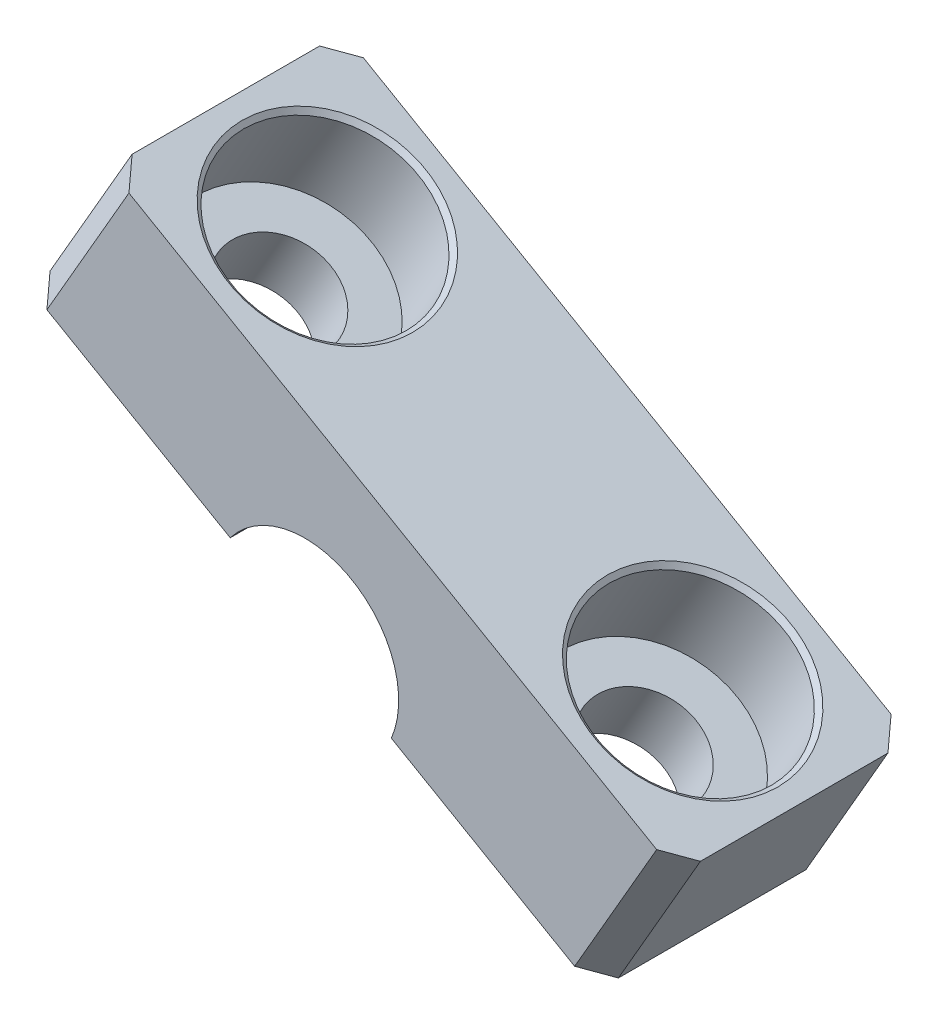
ISO-10303-21;
HEADER;
FILE_DESCRIPTION(('STEP AP214'),'2;1');
FILE_NAME('part.step','',(''),(''),'','','');
FILE_SCHEMA(('AUTOMOTIVE_DESIGN { 1 0 10303 214 1 1 1 1 }'));
ENDSEC;
DATA;
#1=APPLICATION_CONTEXT('core data for automotive mechanical design processes');
#2=APPLICATION_PROTOCOL_DEFINITION('international standard','automotive_design',2000,#1);
#3=PRODUCT_CONTEXT('',#1,'mechanical');
#4=PRODUCT('Part','Part','',(#3));
#5=PRODUCT_RELATED_PRODUCT_CATEGORY('part','',(#4));
#6=PRODUCT_DEFINITION_FORMATION('','',#4);
#7=PRODUCT_DEFINITION_CONTEXT('part definition',#1,'design');
#8=PRODUCT_DEFINITION('design','',#6,#7);
#9=PRODUCT_DEFINITION_SHAPE('','',#8);
#10=(LENGTH_UNIT() NAMED_UNIT(*) SI_UNIT(.MILLI.,.METRE.));
#11=(NAMED_UNIT(*) PLANE_ANGLE_UNIT() SI_UNIT($,.RADIAN.));
#12=(NAMED_UNIT(*) SI_UNIT($,.STERADIAN.) SOLID_ANGLE_UNIT());
#13=UNCERTAINTY_MEASURE_WITH_UNIT(LENGTH_MEASURE(1.E-05),#10,'distance_accuracy_value','');
#14=(GEOMETRIC_REPRESENTATION_CONTEXT(3) GLOBAL_UNCERTAINTY_ASSIGNED_CONTEXT((#13)) GLOBAL_UNIT_ASSIGNED_CONTEXT((#10,
#11,#12)) REPRESENTATION_CONTEXT('',''));
#15=CARTESIAN_POINT('',(0.,0.,0.));
#16=DIRECTION('',(0.,0.,1.));
#17=DIRECTION('',(1.,0.,0.));
#18=AXIS2_PLACEMENT_3D('',#15,#16,#17);
#19=CARTESIAN_POINT('',(18.1416697508025,57.4222937425251,34.));
#20=DIRECTION('',(0.5,0.866025403784439,0.));
#21=DIRECTION('',(-0.866025403784439,0.5,0.));
#22=AXIS2_PLACEMENT_3D('',#19,#20,#21);
#23=PLANE('',#22);
#24=CARTESIAN_POINT('',(21.6057713659404,55.4222937425251,34.));
#25=DIRECTION('',(-0.5,-0.866025403784439,0.));
#26=DIRECTION('',(0.866025403784439,-0.5,0.));
#27=AXIS2_PLACEMENT_3D('',#24,#25,#26);
#28=CIRCLE('',#27,2.25);
#29=CARTESIAN_POINT('',(23.5543285244554,54.2972937425251,34.));
#30=VERTEX_POINT('',#29);
#31=EDGE_CURVE('E20',#30,#30,#28,.T.);
#32=ORIENTED_EDGE('',*,*,#31,.T.);
#33=EDGE_LOOP('',(#32));
#34=FACE_BOUND('',#33,.T.);
#35=CARTESIAN_POINT('',(21.6057713659404,55.422293742525,34.));
#36=DIRECTION('',(-0.5,-0.866025403784439,0.));
#37=DIRECTION('',(0.866025403784439,-0.5,0.));
#38=AXIS2_PLACEMENT_3D('',#35,#36,#37);
#39=CIRCLE('',#38,4.);
#40=CARTESIAN_POINT('',(25.0698729810782,53.422293742525,34.));
#41=VERTEX_POINT('',#40);
#42=EDGE_CURVE('E139',#41,#41,#39,.F.);
#43=ORIENTED_EDGE('',*,*,#42,.T.);
#44=EDGE_LOOP('',(#43));
#45=FACE_BOUND('',#44,.T.);
#46=ADVANCED_FACE('F17',(#34,#45),#23,.T.);
#47=CARTESIAN_POINT('',(23.7057713659404,59.0596004384197,34.));
#48=DIRECTION('',(-0.5,-0.866025403784439,0.));
#49=DIRECTION('',(0.866025403784439,-0.5,0.));
#50=AXIS2_PLACEMENT_3D('',#47,#48,#49);
#51=CYLINDRICAL_SURFACE('',#50,2.25);
#52=CARTESIAN_POINT('',(20.2057713659404,52.9974226119286,34.));
#53=DIRECTION('',(-0.5,-0.866025403784439,0.));
#54=DIRECTION('',(0.866025403784439,-0.5,0.));
#55=AXIS2_PLACEMENT_3D('',#52,#53,#54);
#56=CIRCLE('',#55,2.25);
#57=CARTESIAN_POINT('',(22.1543285244554,51.8724226119286,34.));
#58=VERTEX_POINT('',#57);
#59=EDGE_CURVE('E135',#58,#58,#56,.F.);
#60=ORIENTED_EDGE('',*,*,#59,.F.);
#61=EDGE_LOOP('',(#60));
#62=FACE_BOUND('',#61,.T.);
#63=ORIENTED_EDGE('',*,*,#31,.F.);
#64=EDGE_LOOP('',(#63));
#65=FACE_BOUND('',#64,.T.);
#66=ADVANCED_FACE('F151',(#62,#65),#51,.F.);
#67=CARTESIAN_POINT('',(39.2942286340602,50.0596004384197,34.));
#68=DIRECTION('',(-0.5,-0.866025403784439,0.));
#69=DIRECTION('',(0.866025403784439,-0.5,0.));
#70=AXIS2_PLACEMENT_3D('',#67,#68,#69);
#71=CYLINDRICAL_SURFACE('',#70,2.25);
#72=CARTESIAN_POINT('',(35.7942286340602,43.9974226119287,34.));
#73=DIRECTION('',(-0.5,-0.866025403784439,0.));
#74=DIRECTION('',(0.866025403784439,-0.5,0.));
#75=AXIS2_PLACEMENT_3D('',#72,#73,#74);
#76=CIRCLE('',#75,2.25);
#77=CARTESIAN_POINT('',(37.7427857925752,42.8724226119287,34.));
#78=VERTEX_POINT('',#77);
#79=EDGE_CURVE('E131',#78,#78,#76,.F.);
#80=ORIENTED_EDGE('',*,*,#79,.F.);
#81=EDGE_LOOP('',(#80));
#82=FACE_BOUND('',#81,.T.);
#83=CARTESIAN_POINT('',(37.1942286340602,46.4222937425251,34.));
#84=DIRECTION('',(-0.5,-0.866025403784439,0.));
#85=DIRECTION('',(0.866025403784439,-0.5,0.));
#86=AXIS2_PLACEMENT_3D('',#83,#84,#85);
#87=CIRCLE('',#86,2.25);
#88=CARTESIAN_POINT('',(39.1427857925752,45.2972937425251,34.));
#89=VERTEX_POINT('',#88);
#90=EDGE_CURVE('E142',#89,#89,#87,.T.);
#91=ORIENTED_EDGE('',*,*,#90,.F.);
#92=EDGE_LOOP('',(#91));
#93=FACE_BOUND('',#92,.T.);
#94=ADVANCED_FACE('F153',(#82,#93),#71,.F.);
#95=CARTESIAN_POINT('',(33.7301270189224,48.4222937425251,34.));
#96=DIRECTION('',(0.5,0.866025403784439,0.));
#97=DIRECTION('',(-0.866025403784439,0.5,0.));
#98=AXIS2_PLACEMENT_3D('',#95,#96,#97);
#99=PLANE('',#98);
#100=ORIENTED_EDGE('',*,*,#90,.T.);
#101=EDGE_LOOP('',(#100));
#102=FACE_BOUND('',#101,.T.);
#103=CARTESIAN_POINT('',(37.1942286340602,46.4222937425251,34.));
#104=DIRECTION('',(-0.5,-0.866025403784439,0.));
#105=DIRECTION('',(0.866025403784439,-0.5,0.));
#106=AXIS2_PLACEMENT_3D('',#103,#104,#105);
#107=CIRCLE('',#106,4.);
#108=CARTESIAN_POINT('',(40.658330249198,44.4222937425251,34.));
#109=VERTEX_POINT('',#108);
#110=EDGE_CURVE('E127',#109,#109,#107,.F.);
#111=ORIENTED_EDGE('',*,*,#110,.T.);
#112=EDGE_LOOP('',(#111));
#113=FACE_BOUND('',#112,.T.);
#114=ADVANCED_FACE('F161',(#102,#113),#99,.T.);
#115=CARTESIAN_POINT('',(23.7057713659404,59.0596004384197,34.));
#116=DIRECTION('',(-0.5,-0.866025403784439,0.));
#117=DIRECTION('',(0.866025403784439,-0.5,0.));
#118=AXIS2_PLACEMENT_3D('',#115,#116,#117);
#119=CYLINDRICAL_SURFACE('',#118,4.);
#120=CARTESIAN_POINT('',(23.6057713659232,58.8863953576335,34.));
#121=DIRECTION('',(0.5,0.866025403784439,0.));
#122=DIRECTION('',(0.866025403784439,-0.5,0.));
#123=AXIS2_PLACEMENT_3D('',#120,#121,#122);
#124=CIRCLE('',#123,3.99999999996488);
#125=CARTESIAN_POINT('',(27.0698729810306,56.8863953576511,34.));
#126=VERTEX_POINT('',#125);
#127=EDGE_CURVE('E130',#126,#126,#124,.T.);
#128=ORIENTED_EDGE('',*,*,#127,.T.);
#129=EDGE_LOOP('',(#128));
#130=FACE_BOUND('',#129,.T.);
#131=ORIENTED_EDGE('',*,*,#42,.F.);
#132=EDGE_LOOP('',(#131));
#133=FACE_BOUND('',#132,.T.);
#134=ADVANCED_FACE('F223',(#130,#133),#119,.F.);
#135=CARTESIAN_POINT('',(17.1836570489103,56.7629670685515,29.5));
#136=DIRECTION('',(-0.612372435695794,0.353553390593274,-0.707106781186548));
#137=DIRECTION('',(-0.755928946018455,0.,0.654653670707977));
#138=AXIS2_PLACEMENT_3D('',#135,#136,#137);
#139=PLANE('',#138);
#140=DIRECTION('',(0.612372435695756,-0.353553390593253,-0.707106781186591));
#141=VECTOR('',#140,1.);
#142=CARTESIAN_POINT('',(15.8756443470182,55.4974226119286,30.));
#143=LINE('',#142,#141);
#144=CARTESIAN_POINT('',(15.8756443470182,55.4974226119286,30.));
#145=VERTEX_POINT('',#144);
#146=CARTESIAN_POINT('',(16.7416697508025,54.9974226119287,29.));
#147=VERTEX_POINT('',#146);
#148=EDGE_CURVE('E110',#145,#147,#143,.T.);
#149=ORIENTED_EDGE('',*,*,#148,.F.);
#150=DIRECTION('',(-0.5,-0.866025403784439,0.));
#151=VECTOR('',#150,1.);
#152=CARTESIAN_POINT('',(15.8756443470182,55.4974226119287,30.));
#153=LINE('',#152,#151);
#154=CARTESIAN_POINT('',(19.3756443470181,61.5596004384197,30.));
#155=VERTEX_POINT('',#154);
#156=EDGE_CURVE('E122',#155,#145,#153,.T.);
#157=ORIENTED_EDGE('',*,*,#156,.F.);
#158=DIRECTION('',(0.612372435695788,-0.353553390593285,-0.707106781186548));
#159=VECTOR('',#158,1.);
#160=CARTESIAN_POINT('',(19.375644347018,61.5596004384197,30.));
#161=LINE('',#160,#159);
#162=CARTESIAN_POINT('',(20.2416697508025,61.0596004384197,29.));
#163=VERTEX_POINT('',#162);
#164=EDGE_CURVE('E141',#155,#163,#161,.T.);
#165=ORIENTED_EDGE('',*,*,#164,.T.);
#166=DIRECTION('',(-0.5,-0.866025403784436,0.));
#167=VECTOR('',#166,1.);
#168=CARTESIAN_POINT('',(20.2416697508025,61.0596004384197,29.));
#169=LINE('',#168,#167);
#170=EDGE_CURVE('E113',#163,#147,#169,.T.);
#171=ORIENTED_EDGE('',*,*,#170,.T.);
#172=EDGE_LOOP('',(#149,#157,#165,#171));
#173=FACE_BOUND('',#172,.T.);
#174=ADVANCED_FACE('F220',(#173),#139,.T.);
#175=CARTESIAN_POINT('',(27.75,48.0644099100364,39.));
#176=DIRECTION('',(0.,0.,1.));
#177=DIRECTION('',(1.,0.,0.));
#178=AXIS2_PLACEMENT_3D('',#175,#176,#177);
#179=CYLINDRICAL_SURFACE('',#178,4.);
#180=CARTESIAN_POINT('',(27.75,48.0644099100364,39.));
#181=DIRECTION('',(0.,0.,1.));
#182=DIRECTION('',(1.,0.,0.));
#183=AXIS2_PLACEMENT_3D('',#180,#181,#182);
#184=CIRCLE('',#183,4.);
#185=CARTESIAN_POINT('',(24.5630682287833,50.4817360952272,39.));
#186=VERTEX_POINT('',#185);
#187=CARTESIAN_POINT('',(31.436931771217,46.5131091286303,39.));
#188=VERTEX_POINT('',#187);
#189=EDGE_CURVE('E98',#186,#188,#184,.F.);
#190=ORIENTED_EDGE('',*,*,#189,.F.);
#191=DIRECTION('',(0.,0.,1.));
#192=VECTOR('',#191,1.);
#193=CARTESIAN_POINT('',(24.5630682287834,50.4817360952271,29.));
#194=LINE('',#193,#192);
#195=CARTESIAN_POINT('',(24.5630682287833,50.4817360952272,29.));
#196=VERTEX_POINT('',#195);
#197=EDGE_CURVE('E91',#196,#186,#194,.T.);
#198=ORIENTED_EDGE('',*,*,#197,.F.);
#199=CARTESIAN_POINT('',(27.75,48.0644099100364,29.));
#200=DIRECTION('',(0.,0.,1.));
#201=DIRECTION('',(1.,0.,0.));
#202=AXIS2_PLACEMENT_3D('',#199,#200,#201);
#203=CIRCLE('',#202,4.);
#204=CARTESIAN_POINT('',(31.436931771217,46.5131091286303,29.));
#205=VERTEX_POINT('',#204);
#206=EDGE_CURVE('E95',#196,#205,#203,.F.);
#207=ORIENTED_EDGE('',*,*,#206,.T.);
#208=DIRECTION('',(0.,0.,1.));
#209=VECTOR('',#208,1.);
#210=CARTESIAN_POINT('',(31.4369317712171,46.5131091286302,29.));
#211=LINE('',#210,#209);
#212=EDGE_CURVE('E367',#188,#205,#211,.F.);
#213=ORIENTED_EDGE('',*,*,#212,.F.);
#214=EDGE_LOOP('',(#190,#198,#207,#213));
#215=FACE_BOUND('',#214,.T.);
#216=ADVANCED_FACE('F93',(#215),#179,.F.);
#217=CARTESIAN_POINT('',(18.0586570489103,58.2785115251742,38.5));
#218=DIRECTION('',(-0.612372435695794,0.353553390593274,0.707106781186548));
#219=DIRECTION('',(0.755928946018455,0.,0.654653670707977));
#220=AXIS2_PLACEMENT_3D('',#217,#218,#219);
#221=PLANE('',#220);
#222=DIRECTION('',(-0.612372435695755,0.353553390593252,-0.707106781186593));
#223=VECTOR('',#222,1.);
#224=CARTESIAN_POINT('',(16.7416697508025,54.9974226119287,39.));
#225=LINE('',#224,#223);
#226=CARTESIAN_POINT('',(16.7416697508025,54.9974226119287,39.));
#227=VERTEX_POINT('',#226);
#228=CARTESIAN_POINT('',(15.8756443470182,55.4974226119287,38.));
#229=VERTEX_POINT('',#228);
#230=EDGE_CURVE('E102',#227,#229,#225,.T.);
#231=ORIENTED_EDGE('',*,*,#230,.F.);
#232=DIRECTION('',(-0.5,-0.866025403784436,0.));
#233=VECTOR('',#232,1.);
#234=CARTESIAN_POINT('',(20.2416697508025,61.0596004384197,39.));
#235=LINE('',#234,#233);
#236=CARTESIAN_POINT('',(20.2416697508025,61.0596004384197,39.));
#237=VERTEX_POINT('',#236);
#238=EDGE_CURVE('E373',#237,#227,#235,.T.);
#239=ORIENTED_EDGE('',*,*,#238,.F.);
#240=DIRECTION('',(-0.612372435695788,0.353553390593284,-0.707106781186548));
#241=VECTOR('',#240,1.);
#242=CARTESIAN_POINT('',(20.2416697508025,61.0596004384197,39.));
#243=LINE('',#242,#241);
#244=CARTESIAN_POINT('',(19.3756443470181,61.5596004384197,38.));
#245=VERTEX_POINT('',#244);
#246=EDGE_CURVE('E103',#237,#245,#243,.T.);
#247=ORIENTED_EDGE('',*,*,#246,.T.);
#248=DIRECTION('',(-0.5,-0.866025403784439,0.));
#249=VECTOR('',#248,1.);
#250=CARTESIAN_POINT('',(15.8756443470182,55.4974226119287,38.));
#251=LINE('',#250,#249);
#252=EDGE_CURVE('E119',#229,#245,#251,.F.);
#253=ORIENTED_EDGE('',*,*,#252,.F.);
#254=EDGE_LOOP('',(#231,#239,#247,#253));
#255=FACE_BOUND('',#254,.T.);
#256=ADVANCED_FACE('F213',(#255),#221,.T.);
#257=CARTESIAN_POINT('',(40.1243556529823,41.4974226119287,29.));
#258=DIRECTION('',(-0.5,-0.866025403784439,0.));
#259=DIRECTION('',(0.866025403784439,-0.5,0.));
#260=AXIS2_PLACEMENT_3D('',#257,#258,#259);
#261=PLANE('',#260);
#262=ORIENTED_EDGE('',*,*,#59,.T.);
#263=EDGE_LOOP('',(#262));
#264=FACE_BOUND('',#263,.T.);
#265=ORIENTED_EDGE('',*,*,#148,.T.);
#266=DIRECTION('',(0.866025403784444,-0.499999999999992,0.));
#267=VECTOR('',#266,1.);
#268=CARTESIAN_POINT('',(16.7416697508025,54.9974226119287,29.));
#269=LINE('',#268,#267);
#270=EDGE_CURVE('E107',#147,#196,#269,.T.);
#271=ORIENTED_EDGE('',*,*,#270,.T.);
#272=ORIENTED_EDGE('',*,*,#197,.T.);
#273=DIRECTION('',(0.866025403784444,-0.499999999999992,0.));
#274=VECTOR('',#273,1.);
#275=CARTESIAN_POINT('',(16.7416697508025,54.9974226119287,39.));
#276=LINE('',#275,#274);
#277=EDGE_CURVE('E376',#227,#186,#276,.T.);
#278=ORIENTED_EDGE('',*,*,#277,.F.);
#279=ORIENTED_EDGE('',*,*,#230,.T.);
#280=DIRECTION('',(0.,0.,1.));
#281=VECTOR('',#280,1.);
#282=CARTESIAN_POINT('',(15.8756443470182,55.4974226119287,29.));
#283=LINE('',#282,#281);
#284=EDGE_CURVE('E438',#145,#229,#283,.T.);
#285=ORIENTED_EDGE('',*,*,#284,.F.);
#286=EDGE_LOOP('',(#265,#271,#272,#278,#279,#285));
#287=FACE_BOUND('',#286,.T.);
#288=ADVANCED_FACE('F108',(#264,#287),#261,.T.);
#289=CARTESIAN_POINT('',(42.3163429510902,46.2940559817969,29.5));
#290=DIRECTION('',(0.612372435695794,-0.353553390593274,-0.707106781186548));
#291=DIRECTION('',(-0.755928946018455,0.,-0.654653670707977));
#292=AXIS2_PLACEMENT_3D('',#289,#290,#291);
#293=PLANE('',#292);
#294=DIRECTION('',(0.612372435695789,-0.353553390593285,0.707106781186547));
#295=VECTOR('',#294,1.);
#296=CARTESIAN_POINT('',(42.758330249198,48.0596004384197,29.));
#297=LINE('',#296,#295);
#298=CARTESIAN_POINT('',(42.758330249198,48.0596004384197,29.));
#299=VERTEX_POINT('',#298);
#300=CARTESIAN_POINT('',(43.6243556529823,47.5596004384197,30.));
#301=VERTEX_POINT('',#300);
#302=EDGE_CURVE('E138',#299,#301,#297,.T.);
#303=ORIENTED_EDGE('',*,*,#302,.T.);
#304=DIRECTION('',(0.5,0.866025403784439,0.));
#305=VECTOR('',#304,1.);
#306=CARTESIAN_POINT('',(43.6243556529823,47.5596004384197,30.));
#307=LINE('',#306,#305);
#308=CARTESIAN_POINT('',(40.1243556529823,41.4974226119287,30.));
#309=VERTEX_POINT('',#308);
#310=EDGE_CURVE('E431',#309,#301,#307,.T.);
#311=ORIENTED_EDGE('',*,*,#310,.F.);
#312=DIRECTION('',(0.612372435695784,-0.353553390593271,0.707106781186558));
#313=VECTOR('',#312,1.);
#314=CARTESIAN_POINT('',(39.2583302491979,41.9974226119287,29.));
#315=LINE('',#314,#313);
#316=CARTESIAN_POINT('',(39.2583302491979,41.9974226119287,29.));
#317=VERTEX_POINT('',#316);
#318=EDGE_CURVE('E390',#317,#309,#315,.T.);
#319=ORIENTED_EDGE('',*,*,#318,.F.);
#320=DIRECTION('',(0.5,0.866025403784436,0.));
#321=VECTOR('',#320,1.);
#322=CARTESIAN_POINT('',(39.2583302491979,41.9974226119287,29.));
#323=LINE('',#322,#321);
#324=EDGE_CURVE('E359',#317,#299,#323,.T.);
#325=ORIENTED_EDGE('',*,*,#324,.T.);
#326=EDGE_LOOP('',(#303,#311,#319,#325));
#327=FACE_BOUND('',#326,.T.);
#328=ADVANCED_FACE('F206',(#327),#293,.T.);
#329=CARTESIAN_POINT('',(43.1913429510902,47.8096004384197,38.5));
#330=DIRECTION('',(0.612372435695794,-0.353553390593274,0.707106781186548));
#331=DIRECTION('',(0.755928946018455,0.,-0.654653670707977));
#332=AXIS2_PLACEMENT_3D('',#329,#330,#331);
#333=PLANE('',#332);
#334=DIRECTION('',(-0.612372435695788,0.35355339059329,0.707106781186545));
#335=VECTOR('',#334,1.);
#336=CARTESIAN_POINT('',(43.6243556529823,47.5596004384197,38.));
#337=LINE('',#336,#335);
#338=CARTESIAN_POINT('',(43.6243556529823,47.5596004384197,38.));
#339=VERTEX_POINT('',#338);
#340=CARTESIAN_POINT('',(42.758330249198,48.0596004384197,39.));
#341=VERTEX_POINT('',#340);
#342=EDGE_CURVE('E35',#339,#341,#337,.T.);
#343=ORIENTED_EDGE('',*,*,#342,.T.);
#344=DIRECTION('',(0.5,0.866025403784436,0.));
#345=VECTOR('',#344,1.);
#346=CARTESIAN_POINT('',(39.2583302491979,41.9974226119287,39.));
#347=LINE('',#346,#345);
#348=CARTESIAN_POINT('',(39.2583302491979,41.9974226119287,39.));
#349=VERTEX_POINT('',#348);
#350=EDGE_CURVE('E377',#349,#341,#347,.T.);
#351=ORIENTED_EDGE('',*,*,#350,.F.);
#352=DIRECTION('',(-0.612372435695783,0.35355339059327,0.70710678118656));
#353=VECTOR('',#352,1.);
#354=CARTESIAN_POINT('',(40.1243556529823,41.4974226119287,38.));
#355=LINE('',#354,#353);
#356=CARTESIAN_POINT('',(40.1243556529823,41.4974226119287,38.));
#357=VERTEX_POINT('',#356);
#358=EDGE_CURVE('E134',#357,#349,#355,.T.);
#359=ORIENTED_EDGE('',*,*,#358,.F.);
#360=DIRECTION('',(0.5,0.866025403784439,0.));
#361=VECTOR('',#360,1.);
#362=CARTESIAN_POINT('',(43.6243556529823,47.5596004384197,38.));
#363=LINE('',#362,#361);
#364=EDGE_CURVE('E426',#339,#357,#363,.F.);
#365=ORIENTED_EDGE('',*,*,#364,.F.);
#366=EDGE_LOOP('',(#343,#351,#359,#365));
#367=FACE_BOUND('',#366,.T.);
#368=ADVANCED_FACE('F202',(#367),#333,.T.);
#369=CARTESIAN_POINT('',(40.1243556529823,41.4974226119287,29.));
#370=DIRECTION('',(-0.5,-0.866025403784439,0.));
#371=DIRECTION('',(0.866025403784439,-0.5,0.));
#372=AXIS2_PLACEMENT_3D('',#369,#370,#371);
#373=PLANE('',#372);
#374=ORIENTED_EDGE('',*,*,#79,.T.);
#375=EDGE_LOOP('',(#374));
#376=FACE_BOUND('',#375,.T.);
#377=ORIENTED_EDGE('',*,*,#358,.T.);
#378=DIRECTION('',(0.866025403784441,-0.5,0.));
#379=VECTOR('',#378,1.);
#380=CARTESIAN_POINT('',(31.4369317712171,46.5131091286302,39.));
#381=LINE('',#380,#379);
#382=EDGE_CURVE('E396',#188,#349,#381,.T.);
#383=ORIENTED_EDGE('',*,*,#382,.F.);
#384=ORIENTED_EDGE('',*,*,#212,.T.);
#385=DIRECTION('',(0.866025403784441,-0.5,0.));
#386=VECTOR('',#385,1.);
#387=CARTESIAN_POINT('',(31.4369317712171,46.5131091286302,29.));
#388=LINE('',#387,#386);
#389=EDGE_CURVE('E118',#205,#317,#388,.T.);
#390=ORIENTED_EDGE('',*,*,#389,.T.);
#391=ORIENTED_EDGE('',*,*,#318,.T.);
#392=DIRECTION('',(0.,0.,1.));
#393=VECTOR('',#392,1.);
#394=CARTESIAN_POINT('',(40.1243556529824,41.4974226119287,29.));
#395=LINE('',#394,#393);
#396=EDGE_CURVE('E422',#357,#309,#395,.F.);
#397=ORIENTED_EDGE('',*,*,#396,.F.);
#398=EDGE_LOOP('',(#377,#383,#384,#390,#391,#397));
#399=FACE_BOUND('',#398,.T.);
#400=ADVANCED_FACE('F198',(#376,#399),#373,.T.);
#401=CARTESIAN_POINT('',(39.2942286340602,50.0596004384197,34.));
#402=DIRECTION('',(-0.5,-0.866025403784439,0.));
#403=DIRECTION('',(0.866025403784439,-0.5,0.));
#404=AXIS2_PLACEMENT_3D('',#401,#402,#403);
#405=CYLINDRICAL_SURFACE('',#404,4.);
#406=CARTESIAN_POINT('',(39.1942286340484,49.8863953576424,34.));
#407=DIRECTION('',(0.5,0.866025403784439,0.));
#408=DIRECTION('',(0.866025403784439,-0.5,0.));
#409=AXIS2_PLACEMENT_3D('',#406,#407,#408);
#410=CIRCLE('',#409,4.00000000001174);
#411=CARTESIAN_POINT('',(35.7301270189028,51.8863953576469,34.));
#412=VERTEX_POINT('',#411);
#413=EDGE_CURVE('E425',#412,#412,#410,.T.);
#414=ORIENTED_EDGE('',*,*,#413,.T.);
#415=EDGE_LOOP('',(#414));
#416=FACE_BOUND('',#415,.T.);
#417=ORIENTED_EDGE('',*,*,#110,.F.);
#418=EDGE_LOOP('',(#417));
#419=FACE_BOUND('',#418,.T.);
#420=ADVANCED_FACE('F194',(#416,#419),#405,.F.);
#421=CARTESIAN_POINT('',(23.7057713659486,59.0596004384344,34.));
#422=DIRECTION('',(0.5,0.86602540378444,0.));
#423=DIRECTION('',(-0.86602540378444,0.5,0.));
#424=AXIS2_PLACEMENT_3D('',#421,#422,#423);
#425=CONICAL_SURFACE('',#424,4.20000000000415,0.785398163375633);
#426=CARTESIAN_POINT('',(23.7057713659486,59.0596004384344,34.));
#427=DIRECTION('',(0.5,0.86602540378444,0.));
#428=DIRECTION('',(-0.86602540378444,0.5,0.));
#429=AXIS2_PLACEMENT_3D('',#426,#427,#428);
#430=CIRCLE('',#429,4.20000000000417);
#431=CARTESIAN_POINT('',(20.0684646700504,61.1596004384365,34.));
#432=VERTEX_POINT('',#431);
#433=EDGE_CURVE('E411',#432,#432,#430,.F.);
#434=ORIENTED_EDGE('',*,*,#433,.F.);
#435=EDGE_LOOP('',(#434));
#436=FACE_BOUND('',#435,.T.);
#437=ORIENTED_EDGE('',*,*,#127,.F.);
#438=EDGE_LOOP('',(#437));
#439=FACE_BOUND('',#438,.T.);
#440=ADVANCED_FACE('F191',(#436,#439),#425,.F.);
#441=CARTESIAN_POINT('',(29.75,51.5285115251742,29.));
#442=DIRECTION('',(0.,0.,1.));
#443=DIRECTION('',(1.,0.,0.));
#444=AXIS2_PLACEMENT_3D('',#441,#442,#443);
#445=PLANE('',#444);
#446=ORIENTED_EDGE('',*,*,#270,.F.);
#447=ORIENTED_EDGE('',*,*,#170,.F.);
#448=DIRECTION('',(-0.866025403784439,0.5,0.));
#449=VECTOR('',#448,1.);
#450=CARTESIAN_POINT('',(19.3756443470181,61.5596004384197,29.));
#451=LINE('',#450,#449);
#452=EDGE_CURVE('E408',#299,#163,#451,.T.);
#453=ORIENTED_EDGE('',*,*,#452,.F.);
#454=ORIENTED_EDGE('',*,*,#324,.F.);
#455=ORIENTED_EDGE('',*,*,#389,.F.);
#456=ORIENTED_EDGE('',*,*,#206,.F.);
#457=EDGE_LOOP('',(#446,#447,#453,#454,#455,#456));
#458=FACE_BOUND('',#457,.T.);
#459=ADVANCED_FACE('F115',(#458),#445,.F.);
#460=CARTESIAN_POINT('',(15.8756443470182,55.4974226119287,29.));
#461=DIRECTION('',(-0.866025403784439,0.5,0.));
#462=DIRECTION('',(-0.5,-0.866025403784439,0.));
#463=AXIS2_PLACEMENT_3D('',#460,#461,#462);
#464=PLANE('',#463);
#465=ORIENTED_EDGE('',*,*,#156,.T.);
#466=ORIENTED_EDGE('',*,*,#284,.T.);
#467=ORIENTED_EDGE('',*,*,#252,.T.);
#468=DIRECTION('',(0.,0.,1.));
#469=VECTOR('',#468,1.);
#470=CARTESIAN_POINT('',(19.3756443470181,61.5596004384197,29.));
#471=LINE('',#470,#469);
#472=EDGE_CURVE('E385',#155,#245,#471,.T.);
#473=ORIENTED_EDGE('',*,*,#472,.F.);
#474=EDGE_LOOP('',(#465,#466,#467,#473));
#475=FACE_BOUND('',#474,.T.);
#476=ADVANCED_FACE('F184',(#475),#464,.T.);
#477=CARTESIAN_POINT('',(43.6243556529823,47.5596004384197,39.));
#478=DIRECTION('',(0.,0.,1.));
#479=DIRECTION('',(1.,0.,0.));
#480=AXIS2_PLACEMENT_3D('',#477,#478,#479);
#481=PLANE('',#480);
#482=ORIENTED_EDGE('',*,*,#238,.T.);
#483=ORIENTED_EDGE('',*,*,#277,.T.);
#484=ORIENTED_EDGE('',*,*,#189,.T.);
#485=ORIENTED_EDGE('',*,*,#382,.T.);
#486=ORIENTED_EDGE('',*,*,#350,.T.);
#487=DIRECTION('',(-0.866025403784439,0.5,0.));
#488=VECTOR('',#487,1.);
#489=CARTESIAN_POINT('',(19.3756443470181,61.5596004384197,39.));
#490=LINE('',#489,#488);
#491=EDGE_CURVE('E383',#237,#341,#490,.F.);
#492=ORIENTED_EDGE('',*,*,#491,.F.);
#493=EDGE_LOOP('',(#482,#483,#484,#485,#486,#492));
#494=FACE_BOUND('',#493,.T.);
#495=ADVANCED_FACE('F180',(#494),#481,.T.);
#496=CARTESIAN_POINT('',(43.6243556529823,47.5596004384197,29.));
#497=DIRECTION('',(0.866025403784439,-0.5,0.));
#498=DIRECTION('',(0.5,0.866025403784439,0.));
#499=AXIS2_PLACEMENT_3D('',#496,#497,#498);
#500=PLANE('',#499);
#501=ORIENTED_EDGE('',*,*,#364,.T.);
#502=ORIENTED_EDGE('',*,*,#396,.T.);
#503=ORIENTED_EDGE('',*,*,#310,.T.);
#504=DIRECTION('',(0.,0.,1.));
#505=VECTOR('',#504,1.);
#506=CARTESIAN_POINT('',(43.6243556529823,47.5596004384197,29.));
#507=LINE('',#506,#505);
#508=EDGE_CURVE('E26',#339,#301,#507,.F.);
#509=ORIENTED_EDGE('',*,*,#508,.F.);
#510=EDGE_LOOP('',(#501,#502,#503,#509));
#511=FACE_BOUND('',#510,.T.);
#512=ADVANCED_FACE('F174',(#511),#500,.T.);
#513=CARTESIAN_POINT('',(39.2942286340738,50.0596004384433,34.));
#514=DIRECTION('',(0.5,0.866025403784438,0.));
#515=DIRECTION('',(-0.866025403784438,0.5,0.));
#516=AXIS2_PLACEMENT_3D('',#513,#514,#515);
#517=CONICAL_SURFACE('',#516,4.20000000005102,0.785398163375633);
#518=CARTESIAN_POINT('',(39.2942286340738,50.0596004384433,34.));
#519=DIRECTION('',(0.5,0.866025403784438,0.));
#520=DIRECTION('',(-0.866025403784438,0.5,0.));
#521=AXIS2_PLACEMENT_3D('',#518,#519,#520);
#522=CIRCLE('',#521,4.20000000005102);
#523=CARTESIAN_POINT('',(35.6569219381349,52.1596004384688,34.));
#524=VERTEX_POINT('',#523);
#525=EDGE_CURVE('E11',#524,#524,#522,.F.);
#526=CARTESIAN_POINT('',(35.6569219381349,52.1596004384688,34.));
#527=CARTESIAN_POINT('',(35.6576844910596,52.1567545522102,34.));
#528=CARTESIAN_POINT('',(35.6584470439843,52.1539086659517,34.));
#529=CARTESIAN_POINT('',(35.6599721498336,52.1482168934346,34.));
#530=CARTESIAN_POINT('',(35.6607347027583,52.145371007176,34.));
#531=CARTESIAN_POINT('',(35.6622598086076,52.1396792346589,34.));
#532=CARTESIAN_POINT('',(35.6630223615323,52.1368333484003,34.));
#533=CARTESIAN_POINT('',(35.6645474673816,52.1311415758832,34.));
#534=CARTESIAN_POINT('',(35.6653100203063,52.1282956896246,34.));
#535=CARTESIAN_POINT('',(35.6668351261556,52.1226039171075,34.));
#536=CARTESIAN_POINT('',(35.6675976790803,52.1197580308489,34.));
#537=CARTESIAN_POINT('',(35.6691227849296,52.1140662583318,34.));
#538=CARTESIAN_POINT('',(35.6698853378542,52.1112203720733,34.));
#539=CARTESIAN_POINT('',(35.6714104437036,52.1055285995561,34.));
#540=CARTESIAN_POINT('',(35.6721729966282,52.1026827132976,34.));
#541=CARTESIAN_POINT('',(35.6736981024776,52.0969909407805,34.));
#542=CARTESIAN_POINT('',(35.6744606554022,52.0941450545219,34.));
#543=CARTESIAN_POINT('',(35.6759857612516,52.0884532820048,34.));
#544=CARTESIAN_POINT('',(35.6767483141762,52.0856073957462,34.));
#545=CARTESIAN_POINT('',(35.6782734200256,52.0799156232291,34.));
#546=CARTESIAN_POINT('',(35.6790359729502,52.0770697369705,34.));
#547=CARTESIAN_POINT('',(35.6805610787996,52.0713779644534,34.));
#548=CARTESIAN_POINT('',(35.6813236317242,52.0685320781948,34.));
#549=CARTESIAN_POINT('',(35.6828487375736,52.0628403056777,34.));
#550=CARTESIAN_POINT('',(35.6836112904982,52.0599944194191,34.));
#551=CARTESIAN_POINT('',(35.6851363963476,52.054302646902,34.));
#552=CARTESIAN_POINT('',(35.6858989492722,52.0514567606435,34.));
#553=CARTESIAN_POINT('',(35.6874240551216,52.0457649881263,34.));
#554=CARTESIAN_POINT('',(35.6881866080462,52.0429191018678,34.));
#555=CARTESIAN_POINT('',(35.6897117138956,52.0372273293507,34.));
#556=CARTESIAN_POINT('',(35.6904742668202,52.0343814430921,34.));
#557=CARTESIAN_POINT('',(35.6919993726696,52.028689670575,34.));
#558=CARTESIAN_POINT('',(35.6927619255942,52.0258437843164,34.));
#559=CARTESIAN_POINT('',(35.6942870314436,52.0201520117993,34.));
#560=CARTESIAN_POINT('',(35.6950495843682,52.0173061255407,34.));
#561=CARTESIAN_POINT('',(35.6965746902176,52.0116143530236,34.));
#562=CARTESIAN_POINT('',(35.6973372431422,52.008768466765,34.));
#563=CARTESIAN_POINT('',(35.6988623489915,52.0030766942479,34.));
#564=CARTESIAN_POINT('',(35.6996249019162,52.0002308079894,34.));
#565=CARTESIAN_POINT('',(35.7011500077656,51.9945390354722,34.));
#566=CARTESIAN_POINT('',(35.7019125606902,51.9916931492137,34.));
#567=CARTESIAN_POINT('',(35.7034376665395,51.9860013766965,34.));
#568=CARTESIAN_POINT('',(35.7042002194642,51.983155490438,34.));
#569=CARTESIAN_POINT('',(35.7057253253135,51.9774637179209,34.));
#570=CARTESIAN_POINT('',(35.7064878782382,51.9746178316623,34.));
#571=CARTESIAN_POINT('',(35.7080129840875,51.9689260591452,34.));
#572=CARTESIAN_POINT('',(35.7087755370122,51.9660801728866,34.));
#573=CARTESIAN_POINT('',(35.7103006428615,51.9603884003695,34.));
#574=CARTESIAN_POINT('',(35.7110631957862,51.9575425141109,34.));
#575=CARTESIAN_POINT('',(35.7125883016355,51.9518507415938,34.));
#576=CARTESIAN_POINT('',(35.7133508545602,51.9490048553352,34.));
#577=CARTESIAN_POINT('',(35.7148759604095,51.9433130828181,34.));
#578=CARTESIAN_POINT('',(35.7156385133342,51.9404671965596,34.));
#579=CARTESIAN_POINT('',(35.7171636191835,51.9347754240424,34.));
#580=CARTESIAN_POINT('',(35.7179261721082,51.9319295377839,34.));
#581=CARTESIAN_POINT('',(35.7194512779575,51.9262377652668,34.));
#582=CARTESIAN_POINT('',(35.7202138308822,51.9233918790082,34.));
#583=CARTESIAN_POINT('',(35.7217389367315,51.9177001064911,34.));
#584=CARTESIAN_POINT('',(35.7225014896562,51.9148542202325,34.));
#585=CARTESIAN_POINT('',(35.7240265955055,51.9091624477154,34.));
#586=CARTESIAN_POINT('',(35.7247891484302,51.9063165614568,34.));
#587=CARTESIAN_POINT('',(35.7263142542795,51.9006247889397,34.));
#588=CARTESIAN_POINT('',(35.7270768072042,51.8977789026811,34.));
#589=CARTESIAN_POINT('',(35.7286019130535,51.892087130164,34.));
#590=CARTESIAN_POINT('',(35.7293644659782,51.8892412439055,34.));
#591=CARTESIAN_POINT('',(35.7301270189028,51.8863953576469,34.));
#592=B_SPLINE_CURVE_WITH_KNOTS('',3,(#526,#527,#528,#529,#530,#531,#532,#533,#534,#535,#536,
#537,#538,#539,#540,#541,#542,#543,#544,#545,#546,#547,#548,#549,#550,#551,#552,#553,#554,#555,
#556,#557,#558,#559,#560,#561,#562,#563,#564,#565,#566,#567,#568,#569,#570,#571,#572,#573,#574,
#575,#576,#577,#578,#579,#580,#581,#582,#583,#584,#585,#586,#587,#588,#589,#590,#591),
.UNSPECIFIED.,.F.,.F.,(4,2,2,2,2,2,2,2,2,2,2,2,2,2,2,2,2,2,2,2,2,2,2,2,2,2,2,2,2,2,2,2,4),(0.,
0.00883883476688005,0.0176776695337637,0.0265165043006522,0.0353553390675341,0.044194173834416,
0.0530330086012978,0.0618718433681864,0.0707106781350682,0.0795495129019567,0.0883883476688337,
0.0972271824357205,0.106066017202602,0.114904851969491,0.123743686736366,0.132582521503255,
0.141421356270136,0.150260191037027,0.159099025803907,0.16793786057079,0.176776695337671,
0.185615530104561,0.194454364871441,0.203293199638325,0.212132034405206,0.220970869172095,
0.229809703938977,0.238648538705865,0.247487373472741,0.256326208239629,0.265165043006511,
0.274003877773401,0.282842712540281),.UNSPECIFIED.);
#593=EDGE_CURVE('BSEAM167',#524,#412,#592,.T.);
#594=ORIENTED_EDGE('',*,*,#525,.F.);
#595=ORIENTED_EDGE('',*,*,#413,.F.);
#596=ORIENTED_EDGE('',*,*,#593,.T.);
#597=ORIENTED_EDGE('',*,*,#593,.F.);
#598=EDGE_LOOP('',(#594,#596,#595,#597));
#599=FACE_BOUND('',#598,.T.);
#600=ADVANCED_FACE('F167',(#599),#517,.F.);
#601=CARTESIAN_POINT('',(19.3756443470181,61.5596004384197,29.));
#602=DIRECTION('',(0.5,0.866025403784439,0.));
#603=DIRECTION('',(-0.866025403784439,0.5,0.));
#604=AXIS2_PLACEMENT_3D('',#601,#602,#603);
#605=PLANE('',#604);
#606=ORIENTED_EDGE('',*,*,#525,.T.);
#607=EDGE_LOOP('',(#606));
#608=FACE_BOUND('',#607,.T.);
#609=ORIENTED_EDGE('',*,*,#342,.F.);
#610=ORIENTED_EDGE('',*,*,#508,.T.);
#611=ORIENTED_EDGE('',*,*,#302,.F.);
#612=ORIENTED_EDGE('',*,*,#452,.T.);
#613=ORIENTED_EDGE('',*,*,#164,.F.);
#614=ORIENTED_EDGE('',*,*,#472,.T.);
#615=ORIENTED_EDGE('',*,*,#246,.F.);
#616=ORIENTED_EDGE('',*,*,#491,.T.);
#617=EDGE_LOOP('',(#609,#610,#611,#612,#613,#614,#615,#616));
#618=FACE_BOUND('',#617,.T.);
#619=ORIENTED_EDGE('',*,*,#433,.T.);
#620=EDGE_LOOP('',(#619));
#621=FACE_BOUND('',#620,.T.);
#622=ADVANCED_FACE('F165',(#608,#618,#621),#605,.T.);
#623=CLOSED_SHELL('',(#46,#66,#94,#114,#134,#174,#216,#256,#288,#328,#368,#400,#420,#440,#459,
#476,#495,#512,#600,#622));
#624=MANIFOLD_SOLID_BREP('B1',#623);
#625=ADVANCED_BREP_SHAPE_REPRESENTATION('',(#18,#624),#14);
#626=SHAPE_DEFINITION_REPRESENTATION(#9,#625);
ENDSEC;
END-ISO-10303-21;
